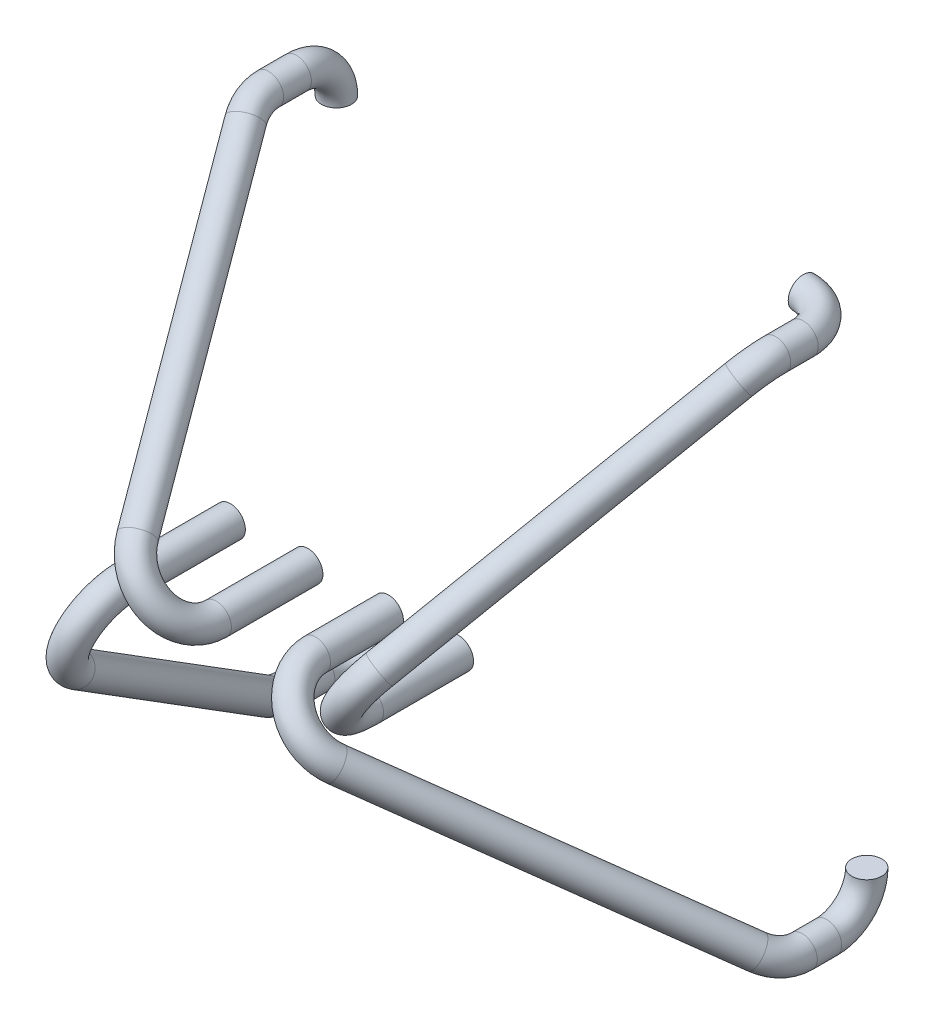
ISO-10303-21;
HEADER;
FILE_DESCRIPTION(('STEP AP214'),'2;1');
FILE_NAME('part.step','',(''),(''),'','','');
FILE_SCHEMA(('AUTOMOTIVE_DESIGN { 1 0 10303 214 1 1 1 1 }'));
ENDSEC;
DATA;
#1=APPLICATION_CONTEXT('core data for automotive mechanical design processes');
#2=APPLICATION_PROTOCOL_DEFINITION('international standard','automotive_design',2000,#1);
#3=PRODUCT_CONTEXT('',#1,'mechanical');
#4=PRODUCT('Part','Part','',(#3));
#5=PRODUCT_RELATED_PRODUCT_CATEGORY('part','',(#4));
#6=PRODUCT_DEFINITION_FORMATION('','',#4);
#7=PRODUCT_DEFINITION_CONTEXT('part definition',#1,'design');
#8=PRODUCT_DEFINITION('design','',#6,#7);
#9=PRODUCT_DEFINITION_SHAPE('','',#8);
#10=(LENGTH_UNIT() NAMED_UNIT(*) SI_UNIT(.MILLI.,.METRE.));
#11=(NAMED_UNIT(*) PLANE_ANGLE_UNIT() SI_UNIT($,.RADIAN.));
#12=(NAMED_UNIT(*) SI_UNIT($,.STERADIAN.) SOLID_ANGLE_UNIT());
#13=UNCERTAINTY_MEASURE_WITH_UNIT(LENGTH_MEASURE(1.E-05),#10,'distance_accuracy_value','');
#14=(GEOMETRIC_REPRESENTATION_CONTEXT(3) GLOBAL_UNCERTAINTY_ASSIGNED_CONTEXT((#13)) GLOBAL_UNIT_ASSIGNED_CONTEXT((#10,
#11,#12)) REPRESENTATION_CONTEXT('',''));
#15=CARTESIAN_POINT('',(0.,0.,0.));
#16=DIRECTION('',(0.,0.,1.));
#17=DIRECTION('',(1.,0.,0.));
#18=AXIS2_PLACEMENT_3D('',#15,#16,#17);
#19=CARTESIAN_POINT('',(15.3,0.,129.9));
#20=DIRECTION('',(0.,0.,-1.));
#21=DIRECTION('',(0.,-1.,0.));
#22=AXIS2_PLACEMENT_3D('',#19,#20,#21);
#23=PLANE('',#22);
#24=CARTESIAN_POINT('',(15.3,0.,129.9));
#25=DIRECTION('',(0.,0.,-1.));
#26=DIRECTION('',(-0.441251924063759,0.897383273473509,0.));
#27=AXIS2_PLACEMENT_3D('',#24,#25,#26);
#28=CIRCLE('',#27,3.);
#29=CARTESIAN_POINT('',(13.9762442278087,2.69214982042053,129.9));
#30=VERTEX_POINT('',#29);
#31=EDGE_CURVE('P0_E10',#30,#30,#28,.T.);
#32=ORIENTED_EDGE('',*,*,#31,.T.);
#33=EDGE_LOOP('',(#32));
#34=FACE_BOUND('',#33,.T.);
#35=ADVANCED_FACE('P0_F15',(#34),#23,.T.);
#36=CARTESIAN_POINT('',(40.3,53.,86.));
#37=DIRECTION('',(1.,0.,0.));
#38=DIRECTION('',(0.,1.,0.));
#39=AXIS2_PLACEMENT_3D('',#36,#37,#38);
#40=PLANE('',#39);
#41=CARTESIAN_POINT('',(40.3,53.,86.));
#42=DIRECTION('',(1.,0.,0.));
#43=DIRECTION('',(0.,0.,1.));
#44=AXIS2_PLACEMENT_3D('',#41,#42,#43);
#45=CIRCLE('',#44,3.);
#46=CARTESIAN_POINT('',(40.3,53.,89.));
#47=VERTEX_POINT('',#46);
#48=EDGE_CURVE('P0_E46',#47,#47,#45,.T.);
#49=ORIENTED_EDGE('',*,*,#48,.F.);
#50=EDGE_LOOP('',(#49));
#51=FACE_BOUND('',#50,.T.);
#52=ADVANCED_FACE('P0_F79',(#51),#40,.F.);
#53=CARTESIAN_POINT('',(15.3,0.,147.87522996171));
#54=DIRECTION('',(0.,0.,-1.));
#55=DIRECTION('',(-0.441251924063759,0.897383273473509,0.));
#56=AXIS2_PLACEMENT_3D('',#53,#54,#55);
#57=CYLINDRICAL_SURFACE('',#56,3.);
#58=ORIENTED_EDGE('',*,*,#31,.F.);
#59=EDGE_LOOP('',(#58));
#60=FACE_BOUND('',#59,.T.);
#61=CARTESIAN_POINT('',(15.3,0.,147.87522996171));
#62=DIRECTION('',(0.,0.,1.));
#63=DIRECTION('',(-0.528558452745041,-0.848896908954066,0.));
#64=AXIS2_PLACEMENT_3D('',#61,#62,#63);
#65=CIRCLE('',#64,3.);
#66=CARTESIAN_POINT('',(13.7143246417651,-2.54669072686217,147.87522996171));
#67=VERTEX_POINT('',#66);
#68=EDGE_CURVE('P0_E23',#67,#67,#65,.T.);
#69=ORIENTED_EDGE('',*,*,#68,.F.);
#70=EDGE_LOOP('',(#69));
#71=FACE_BOUND('',#70,.T.);
#72=ADVANCED_FACE('P0_F17',(#60,#71),#57,.T.);
#73=CARTESIAN_POINT('',(20.057026074705,7.640072180587,147.87522996171));
#74=DIRECTION('',(0.848896908954174,-0.528558452744869,1.8632009515487E-13));
#75=DIRECTION('',(0.389289371715224,0.625222324270361,0.67642503672139));
#76=AXIS2_PLACEMENT_3D('',#73,#74,#75);
#77=TOROIDAL_SURFACE('',#76,9.,3.);
#78=CARTESIAN_POINT('',(23.560630420144,13.267073099019,153.9630552922));
#79=DIRECTION('',(-0.357530170807117,-0.574215122812097,0.736511486466112));
#80=DIRECTION('',(-0.926388150015953,0.118225092398994,-0.357530170806982));
#81=AXIS2_PLACEMENT_3D('',#78,#79,#80);
#82=CIRCLE('',#81,3.);
#83=CARTESIAN_POINT('',(24.7284985352912,15.1427400718311,155.992330402365));
#84=VERTEX_POINT('',#83);
#85=EDGE_CURVE('P0_E32',#84,#84,#82,.T.);
#86=CARTESIAN_POINT('',(20.057026074705,7.640072180587,147.87522996171));
#87=DIRECTION('',(0.848896908954174,-0.528558452744869,1.8632009515487E-13));
#88=DIRECTION('',(0.389289371715224,0.625222324270361,0.67642503672139));
#89=AXIS2_PLACEMENT_3D('',#86,#87,#88);
#90=CIRCLE('',#89,12.);
#91=EDGE_CURVE('',#84,#67,#90,.T.);
#92=ORIENTED_EDGE('',*,*,#85,.T.);
#93=ORIENTED_EDGE('',*,*,#68,.T.);
#94=ORIENTED_EDGE('',*,*,#91,.T.);
#95=ORIENTED_EDGE('',*,*,#91,.F.);
#96=EDGE_LOOP('',(#92,#94,#93,#95));
#97=FACE_BOUND('',#96,.T.);
#98=ADVANCED_FACE('P0_F66',(#97),#77,.T.);
#99=CARTESIAN_POINT('',(47.046578270734,50.986928737845,105.58204642955));
#100=DIRECTION('',(-0.357530170807117,-0.574215122812097,0.736511486466112));
#101=DIRECTION('',(-0.926388150015953,0.118225092398994,-0.357530170806982));
#102=AXIS2_PLACEMENT_3D('',#99,#100,#101);
#103=CYLINDRICAL_SURFACE('',#102,3.);
#104=ORIENTED_EDGE('',*,*,#85,.F.);
#105=EDGE_LOOP('',(#104));
#106=FACE_BOUND('',#105,.T.);
#107=CARTESIAN_POINT('',(47.046578270734,50.986928737845,105.58204642955));
#108=DIRECTION('',(0.357530170807098,0.574215122812158,-0.736511486466074));
#109=DIRECTION('',(0.389289371715224,0.625222324270361,0.67642503672139));
#110=AXIS2_PLACEMENT_3D('',#107,#108,#109);
#111=CIRCLE('',#110,3.);
#112=CARTESIAN_POINT('',(48.2144463858812,52.8625957106571,107.611321539715));
#113=VERTEX_POINT('',#112);
#114=EDGE_CURVE('P0_E40',#113,#113,#111,.T.);
#115=ORIENTED_EDGE('',*,*,#114,.F.);
#116=EDGE_LOOP('',(#115));
#117=FACE_BOUND('',#116,.T.);
#118=ADVANCED_FACE('P0_F64',(#106,#117),#103,.T.);
#119=CARTESIAN_POINT('',(43.542973925295,45.359927819413,99.49422109906));
#120=DIRECTION('',(0.848896908954066,-0.528558452745041,0.));
#121=DIRECTION('',(0.528558452745041,0.848896908954066,0.));
#122=AXIS2_PLACEMENT_3D('',#119,#120,#121);
#123=TOROIDAL_SURFACE('',#122,9.,3.);
#124=CARTESIAN_POINT('',(48.3,53.,99.49422109906));
#125=DIRECTION('',(0.,0.,1.));
#126=DIRECTION('',(-1.,0.,0.));
#127=AXIS2_PLACEMENT_3D('',#124,#125,#126);
#128=CIRCLE('',#127,3.);
#129=CARTESIAN_POINT('',(49.8856753582349,55.5466907268622,99.49422109906));
#130=VERTEX_POINT('',#129);
#131=EDGE_CURVE('P0_E51',#130,#130,#128,.T.);
#132=CARTESIAN_POINT('',(43.542973925295,45.359927819413,99.49422109906));
#133=DIRECTION('',(0.848896908954066,-0.528558452745041,0.));
#134=DIRECTION('',(0.528558452745041,0.848896908954066,0.));
#135=AXIS2_PLACEMENT_3D('',#132,#133,#134);
#136=CIRCLE('',#135,12.);
#137=EDGE_CURVE('',#130,#113,#136,.T.);
#138=ORIENTED_EDGE('',*,*,#131,.T.);
#139=ORIENTED_EDGE('',*,*,#114,.T.);
#140=ORIENTED_EDGE('',*,*,#137,.T.);
#141=ORIENTED_EDGE('',*,*,#137,.F.);
#142=EDGE_LOOP('',(#138,#140,#139,#141));
#143=FACE_BOUND('',#142,.T.);
#144=ADVANCED_FACE('P0_F61',(#143),#123,.T.);
#145=CARTESIAN_POINT('',(48.3,53.,93.999));
#146=DIRECTION('',(0.,0.,1.));
#147=DIRECTION('',(-1.,0.,0.));
#148=AXIS2_PLACEMENT_3D('',#145,#146,#147);
#149=CYLINDRICAL_SURFACE('',#148,3.);
#150=ORIENTED_EDGE('',*,*,#131,.F.);
#151=EDGE_LOOP('',(#150));
#152=FACE_BOUND('',#151,.T.);
#153=CARTESIAN_POINT('',(48.3,53.,93.999));
#154=DIRECTION('',(0.,0.,-1.));
#155=DIRECTION('',(1.,0.,0.));
#156=AXIS2_PLACEMENT_3D('',#153,#154,#155);
#157=CIRCLE('',#156,3.);
#158=CARTESIAN_POINT('',(51.3,53.,93.999));
#159=VERTEX_POINT('',#158);
#160=EDGE_CURVE('P0_E49',#159,#159,#157,.T.);
#161=ORIENTED_EDGE('',*,*,#160,.F.);
#162=EDGE_LOOP('',(#161));
#163=FACE_BOUND('',#162,.T.);
#164=ADVANCED_FACE('P0_F75',(#152,#163),#149,.T.);
#165=CARTESIAN_POINT('',(40.301,53.,93.999));
#166=DIRECTION('',(0.,-1.,0.));
#167=DIRECTION('',(0.,0.,-1.));
#168=AXIS2_PLACEMENT_3D('',#165,#166,#167);
#169=TOROIDAL_SURFACE('',#168,7.999,3.);
#170=CARTESIAN_POINT('',(40.301,53.,86.));
#171=DIRECTION('',(1.,0.,0.));
#172=DIRECTION('',(0.,0.,1.));
#173=AXIS2_PLACEMENT_3D('',#170,#171,#172);
#174=CIRCLE('',#173,3.);
#175=CARTESIAN_POINT('',(40.301,53.,83.));
#176=VERTEX_POINT('',#175);
#177=EDGE_CURVE('P0_E43',#176,#176,#174,.T.);
#178=CARTESIAN_POINT('',(40.301,53.,93.999));
#179=DIRECTION('',(0.,-1.,0.));
#180=DIRECTION('',(0.,0.,-1.));
#181=AXIS2_PLACEMENT_3D('',#178,#179,#180);
#182=CIRCLE('',#181,10.999);
#183=EDGE_CURVE('',#176,#159,#182,.T.);
#184=ORIENTED_EDGE('',*,*,#177,.T.);
#185=ORIENTED_EDGE('',*,*,#160,.T.);
#186=ORIENTED_EDGE('',*,*,#183,.T.);
#187=ORIENTED_EDGE('',*,*,#183,.F.);
#188=EDGE_LOOP('',(#184,#186,#185,#187));
#189=FACE_BOUND('',#188,.T.);
#190=ADVANCED_FACE('P0_F90',(#189),#169,.T.);
#191=CARTESIAN_POINT('',(40.3,53.,86.));
#192=DIRECTION('',(1.,0.,0.));
#193=DIRECTION('',(0.,0.,1.));
#194=AXIS2_PLACEMENT_3D('',#191,#192,#193);
#195=CYLINDRICAL_SURFACE('',#194,3.);
#196=ORIENTED_EDGE('',*,*,#177,.F.);
#197=EDGE_LOOP('',(#196));
#198=FACE_BOUND('',#197,.T.);
#199=ORIENTED_EDGE('',*,*,#48,.T.);
#200=EDGE_LOOP('',(#199));
#201=FACE_BOUND('',#200,.T.);
#202=ADVANCED_FACE('P0_F94',(#198,#201),#195,.T.);
#203=CLOSED_SHELL('',(#35,#52,#72,#98,#118,#144,#164,#190,#202));
#204=MANIFOLD_SOLID_BREP('P0_B1',#203);
#205=CARTESIAN_POINT('',(-14.8,0.,129.9));
#206=DIRECTION('',(0.,0.,-1.));
#207=DIRECTION('',(0.,-1.,0.));
#208=AXIS2_PLACEMENT_3D('',#205,#206,#207);
#209=PLANE('',#208);
#210=CARTESIAN_POINT('',(-14.8,0.,129.9));
#211=DIRECTION('',(0.,0.,-1.));
#212=DIRECTION('',(-0.973099550912096,0.230385034268022,0.));
#213=AXIS2_PLACEMENT_3D('',#210,#211,#212);
#214=CIRCLE('',#213,3.);
#215=CARTESIAN_POINT('',(-17.7192986527363,0.691155102804067,129.9));
#216=VERTEX_POINT('',#215);
#217=EDGE_CURVE('P1_E10',#216,#216,#214,.T.);
#218=ORIENTED_EDGE('',*,*,#217,.T.);
#219=EDGE_LOOP('',(#218));
#220=FACE_BOUND('',#219,.T.);
#221=ADVANCED_FACE('P1_F15',(#220),#209,.T.);
#222=CARTESIAN_POINT('',(-53.,40.3,86.));
#223=DIRECTION('',(0.,1.,0.));
#224=DIRECTION('',(1.,0.,0.));
#225=AXIS2_PLACEMENT_3D('',#222,#223,#224);
#226=PLANE('',#225);
#227=CARTESIAN_POINT('',(-53.,40.3,86.));
#228=DIRECTION('',(0.,1.,0.));
#229=DIRECTION('',(0.,0.,1.));
#230=AXIS2_PLACEMENT_3D('',#227,#228,#229);
#231=CIRCLE('',#230,3.);
#232=CARTESIAN_POINT('',(-53.,40.3,89.));
#233=VERTEX_POINT('',#232);
#234=EDGE_CURVE('P1_E36',#233,#233,#231,.T.);
#235=ORIENTED_EDGE('',*,*,#234,.F.);
#236=EDGE_LOOP('',(#235));
#237=FACE_BOUND('',#236,.T.);
#238=ADVANCED_FACE('P1_F76',(#237),#226,.F.);
#239=CARTESIAN_POINT('',(-14.8,0.,148.1952931675));
#240=DIRECTION('',(0.,0.,-1.));
#241=DIRECTION('',(-0.973099550912096,0.230385034268022,0.));
#242=AXIS2_PLACEMENT_3D('',#239,#240,#241);
#243=CYLINDRICAL_SURFACE('',#242,3.);
#244=ORIENTED_EDGE('',*,*,#217,.F.);
#245=EDGE_LOOP('',(#244));
#246=FACE_BOUND('',#245,.T.);
#247=CARTESIAN_POINT('',(-14.8,0.,148.1952931675));
#248=DIRECTION('',(0.,0.,1.));
#249=DIRECTION('',(0.620328528173251,-0.784342091905317,0.));
#250=AXIS2_PLACEMENT_3D('',#247,#248,#249);
#251=CIRCLE('',#250,3.);
#252=CARTESIAN_POINT('',(-12.9390144154792,-2.35302627571637,148.1952931675));
#253=VERTEX_POINT('',#252);
#254=EDGE_CURVE('P1_E18',#253,#253,#251,.T.);
#255=ORIENTED_EDGE('',*,*,#254,.F.);
#256=EDGE_LOOP('',(#255));
#257=FACE_BOUND('',#256,.T.);
#258=ADVANCED_FACE('P1_F71',(#246,#257),#243,.T.);
#259=CARTESIAN_POINT('',(-20.38295675356,7.059078827146,148.1952931675));
#260=DIRECTION('',(0.784342091905281,0.620328528173297,0.));
#261=DIRECTION('',(-0.461999486460211,0.584151183142266,0.667325909690304));
#262=AXIS2_PLACEMENT_3D('',#259,#260,#261);
#263=TOROIDAL_SURFACE('',#262,9.,3.);
#264=CARTESIAN_POINT('',(-24.5409521317,12.316439475427,154.20122635471));
#265=DIRECTION('',(0.413961299369841,-0.523411799988945,0.744765822427671));
#266=DIRECTION('',(-0.124184131786939,-0.842981843840584,-0.523411799988741));
#267=AXIS2_PLACEMENT_3D('',#264,#265,#266);
#268=CIRCLE('',#267,3.);
#269=CARTESIAN_POINT('',(-25.9269505910815,14.0688930248558,156.203204083782));
#270=VERTEX_POINT('',#269);
#271=EDGE_CURVE('P1_E32',#270,#270,#268,.T.);
#272=CARTESIAN_POINT('',(-20.38295675356,7.059078827146,148.1952931675));
#273=DIRECTION('',(0.784342091905281,0.620328528173297,0.));
#274=DIRECTION('',(-0.461999486460211,0.584151183142266,0.667325909690304));
#275=AXIS2_PLACEMENT_3D('',#272,#273,#274);
#276=CIRCLE('',#275,12.);
#277=EDGE_CURVE('',#270,#253,#276,.T.);
#278=ORIENTED_EDGE('',*,*,#271,.T.);
#279=ORIENTED_EDGE('',*,*,#254,.T.);
#280=ORIENTED_EDGE('',*,*,#277,.T.);
#281=ORIENTED_EDGE('',*,*,#277,.F.);
#282=EDGE_LOOP('',(#278,#280,#279,#281));
#283=FACE_BOUND('',#282,.T.);
#284=ADVANCED_FACE('P1_F60',(#283),#263,.T.);
#285=CARTESIAN_POINT('',(-51.57503862458,46.498281821135,105.56367571631));
#286=DIRECTION('',(0.413961299369841,-0.523411799988945,0.744765822427671));
#287=DIRECTION('',(-0.124184131786939,-0.842981843840584,-0.523411799988741));
#288=AXIS2_PLACEMENT_3D('',#285,#286,#287);
#289=CYLINDRICAL_SURFACE('',#288,3.);
#290=ORIENTED_EDGE('',*,*,#271,.F.);
#291=EDGE_LOOP('',(#290));
#292=FACE_BOUND('',#291,.T.);
#293=CARTESIAN_POINT('',(-51.57503862458,46.498281821135,105.56367571631));
#294=DIRECTION('',(-0.413961299370079,0.523411799989099,-0.744765822427431));
#295=DIRECTION('',(-0.461999486460211,0.584151183142266,0.667325909690304));
#296=AXIS2_PLACEMENT_3D('',#293,#294,#295);
#297=CIRCLE('',#296,3.);
#298=CARTESIAN_POINT('',(-52.961037083964,48.2507353705632,107.565653445379));
#299=VERTEX_POINT('',#298);
#300=EDGE_CURVE('P1_E47',#299,#299,#297,.T.);
#301=ORIENTED_EDGE('',*,*,#300,.F.);
#302=EDGE_LOOP('',(#301));
#303=FACE_BOUND('',#302,.T.);
#304=ADVANCED_FACE('P1_F58',(#292,#303),#289,.T.);
#305=CARTESIAN_POINT('',(-47.41704324643,41.240921172853,99.557742529106));
#306=DIRECTION('',(0.784342091905317,0.620328528173251,0.));
#307=DIRECTION('',(-0.620328528173251,0.784342091905317,0.));
#308=AXIS2_PLACEMENT_3D('',#305,#306,#307);
#309=TOROIDAL_SURFACE('',#308,9.,3.);
#310=CARTESIAN_POINT('',(-53.,48.3,99.557742529107));
#311=DIRECTION('',(0.,0.,1.));
#312=DIRECTION('',(0.,-1.,0.));
#313=AXIS2_PLACEMENT_3D('',#310,#311,#312);
#314=CIRCLE('',#313,3.);
#315=CARTESIAN_POINT('',(-54.8609855845184,50.6530262757094,99.5577425291073));
#316=VERTEX_POINT('',#315);
#317=EDGE_CURVE('P1_E43',#316,#316,#314,.T.);
#318=CARTESIAN_POINT('',(-47.41704324643,41.240921172853,99.557742529106));
#319=DIRECTION('',(0.784342091905317,0.620328528173251,0.));
#320=DIRECTION('',(-0.620328528173251,0.784342091905317,0.));
#321=AXIS2_PLACEMENT_3D('',#318,#319,#320);
#322=CIRCLE('',#321,12.);
#323=EDGE_CURVE('',#316,#299,#322,.T.);
#324=ORIENTED_EDGE('',*,*,#317,.T.);
#325=ORIENTED_EDGE('',*,*,#300,.T.);
#326=ORIENTED_EDGE('',*,*,#323,.T.);
#327=ORIENTED_EDGE('',*,*,#323,.F.);
#328=EDGE_LOOP('',(#324,#326,#325,#327));
#329=FACE_BOUND('',#328,.T.);
#330=ADVANCED_FACE('P1_F55',(#329),#309,.T.);
#331=CARTESIAN_POINT('',(-53.,48.3,93.999));
#332=DIRECTION('',(0.,0.,1.));
#333=DIRECTION('',(0.,-1.,0.));
#334=AXIS2_PLACEMENT_3D('',#331,#332,#333);
#335=CYLINDRICAL_SURFACE('',#334,3.);
#336=ORIENTED_EDGE('',*,*,#317,.F.);
#337=EDGE_LOOP('',(#336));
#338=FACE_BOUND('',#337,.T.);
#339=CARTESIAN_POINT('',(-53.,48.3,93.999));
#340=DIRECTION('',(0.,0.,-1.));
#341=DIRECTION('',(0.,1.,0.));
#342=AXIS2_PLACEMENT_3D('',#339,#340,#341);
#343=CIRCLE('',#342,3.);
#344=CARTESIAN_POINT('',(-53.,51.3,93.999));
#345=VERTEX_POINT('',#344);
#346=EDGE_CURVE('P1_E39',#345,#345,#343,.T.);
#347=ORIENTED_EDGE('',*,*,#346,.F.);
#348=EDGE_LOOP('',(#347));
#349=FACE_BOUND('',#348,.T.);
#350=ADVANCED_FACE('P1_F69',(#338,#349),#335,.T.);
#351=CARTESIAN_POINT('',(-53.,40.301,93.999));
#352=DIRECTION('',(1.,0.,0.));
#353=DIRECTION('',(0.,0.,-1.));
#354=AXIS2_PLACEMENT_3D('',#351,#352,#353);
#355=TOROIDAL_SURFACE('',#354,7.999,3.);
#356=CARTESIAN_POINT('',(-53.,40.301,86.));
#357=DIRECTION('',(0.,1.,0.));
#358=DIRECTION('',(0.,0.,1.));
#359=AXIS2_PLACEMENT_3D('',#356,#357,#358);
#360=CIRCLE('',#359,3.);
#361=CARTESIAN_POINT('',(-53.,40.301,83.));
#362=VERTEX_POINT('',#361);
#363=EDGE_CURVE('P1_E35',#362,#362,#360,.T.);
#364=CARTESIAN_POINT('',(-53.,40.301,93.999));
#365=DIRECTION('',(1.,0.,0.));
#366=DIRECTION('',(0.,0.,-1.));
#367=AXIS2_PLACEMENT_3D('',#364,#365,#366);
#368=CIRCLE('',#367,10.999);
#369=EDGE_CURVE('',#362,#345,#368,.T.);
#370=ORIENTED_EDGE('',*,*,#363,.T.);
#371=ORIENTED_EDGE('',*,*,#346,.T.);
#372=ORIENTED_EDGE('',*,*,#369,.T.);
#373=ORIENTED_EDGE('',*,*,#369,.F.);
#374=EDGE_LOOP('',(#370,#372,#371,#373));
#375=FACE_BOUND('',#374,.T.);
#376=ADVANCED_FACE('P1_F92',(#375),#355,.T.);
#377=CARTESIAN_POINT('',(-53.,40.3,86.));
#378=DIRECTION('',(0.,1.,0.));
#379=DIRECTION('',(0.,0.,1.));
#380=AXIS2_PLACEMENT_3D('',#377,#378,#379);
#381=CYLINDRICAL_SURFACE('',#380,3.);
#382=ORIENTED_EDGE('',*,*,#363,.F.);
#383=EDGE_LOOP('',(#382));
#384=FACE_BOUND('',#383,.T.);
#385=ORIENTED_EDGE('',*,*,#234,.T.);
#386=EDGE_LOOP('',(#385));
#387=FACE_BOUND('',#386,.T.);
#388=ADVANCED_FACE('P1_F90',(#384,#387),#381,.T.);
#389=CLOSED_SHELL('',(#221,#238,#258,#284,#304,#330,#350,#376,#388));
#390=MANIFOLD_SOLID_BREP('P1_B1',#389);
#391=CARTESIAN_POINT('',(1.3,0.,129.9));
#392=DIRECTION('',(0.,0.,-1.));
#393=DIRECTION('',(0.,-1.,0.));
#394=AXIS2_PLACEMENT_3D('',#391,#392,#393);
#395=PLANE('',#394);
#396=CARTESIAN_POINT('',(1.3,0.,129.9));
#397=DIRECTION('',(0.,0.,-1.));
#398=DIRECTION('',(-0.997690669585959,-0.0679214827659172,0.));
#399=AXIS2_PLACEMENT_3D('',#396,#397,#398);
#400=CIRCLE('',#399,3.);
#401=CARTESIAN_POINT('',(-1.69307200875788,-0.203764448297752,129.9));
#402=VERTEX_POINT('',#401);
#403=EDGE_CURVE('P2_E10',#402,#402,#400,.T.);
#404=ORIENTED_EDGE('',*,*,#403,.T.);
#405=EDGE_LOOP('',(#404));
#406=FACE_BOUND('',#405,.T.);
#407=ADVANCED_FACE('P2_F15',(#406),#395,.T.);
#408=CARTESIAN_POINT('',(53.,-40.3,86.));
#409=DIRECTION('',(0.,-1.,0.));
#410=DIRECTION('',(0.,0.,-1.));
#411=AXIS2_PLACEMENT_3D('',#408,#409,#410);
#412=PLANE('',#411);
#413=CARTESIAN_POINT('',(53.,-40.3,86.));
#414=DIRECTION('',(0.,-1.,0.));
#415=DIRECTION('',(0.,0.,-1.));
#416=AXIS2_PLACEMENT_3D('',#413,#414,#415);
#417=CIRCLE('',#416,3.);
#418=CARTESIAN_POINT('',(53.,-40.3,83.));
#419=VERTEX_POINT('',#418);
#420=EDGE_CURVE('P2_E37',#419,#419,#417,.T.);
#421=ORIENTED_EDGE('',*,*,#420,.F.);
#422=EDGE_LOOP('',(#421));
#423=FACE_BOUND('',#422,.T.);
#424=ADVANCED_FACE('P2_F17',(#423),#412,.F.);
#425=CARTESIAN_POINT('',(1.3,0.,144.46153829951));
#426=DIRECTION('',(0.,0.,-1.));
#427=DIRECTION('',(-0.997690669585959,-0.0679214827659172,0.));
#428=AXIS2_PLACEMENT_3D('',#425,#426,#427);
#429=CYLINDRICAL_SURFACE('',#428,3.);
#430=ORIENTED_EDGE('',*,*,#403,.F.);
#431=EDGE_LOOP('',(#430));
#432=FACE_BOUND('',#431,.T.);
#433=CARTESIAN_POINT('',(1.3,0.,144.46153829951));
#434=DIRECTION('',(0.,0.,1.));
#435=DIRECTION('',(-0.730726174010094,0.682670680941088,0.));
#436=AXIS2_PLACEMENT_3D('',#433,#434,#435);
#437=CIRCLE('',#436,3.);
#438=CARTESIAN_POINT('',(-0.892178522029229,2.04801204282424,144.46153829951));
#439=VERTEX_POINT('',#438);
#440=EDGE_CURVE('P2_E19',#439,#439,#437,.T.);
#441=ORIENTED_EDGE('',*,*,#440,.F.);
#442=EDGE_LOOP('',(#441));
#443=FACE_BOUND('',#442,.T.);
#444=ADVANCED_FACE('P2_F92',(#432,#443),#429,.T.);
#445=CARTESIAN_POINT('',(7.876535566088,-6.144036128473,144.46153829951));
#446=DIRECTION('',(-0.682670680941211,-0.73072617400998,-1.9408343245299E-13));
#447=DIRECTION('',(0.477744575833087,-0.446326170459081,0.756672366236137));
#448=AXIS2_PLACEMENT_3D('',#445,#446,#447);
#449=TOROIDAL_SURFACE('',#448,9.,3.);
#450=CARTESIAN_POINT('',(12.176236748585,-10.1609716626,151.27158959564));
#451=DIRECTION('',(-0.552920303158725,0.516558039508112,0.653794256761559));
#452=DIRECTION('',(-0.172703119893036,-0.838654532092178,0.51655803950811));
#453=AXIS2_PLACEMENT_3D('',#450,#451,#452);
#454=CIRCLE('',#453,3.);
#455=CARTESIAN_POINT('',(13.6094704760833,-11.499950173975,153.541606694349));
#456=VERTEX_POINT('',#455);
#457=EDGE_CURVE('P2_E33',#456,#456,#454,.T.);
#458=CARTESIAN_POINT('',(7.876535566088,-6.144036128473,144.46153829951));
#459=DIRECTION('',(-0.682670680941211,-0.73072617400998,-1.9408343245299E-13));
#460=DIRECTION('',(0.477744575833087,-0.446326170459081,0.756672366236137));
#461=AXIS2_PLACEMENT_3D('',#458,#459,#460);
#462=CIRCLE('',#461,12.);
#463=EDGE_CURVE('',#456,#439,#462,.T.);
#464=ORIENTED_EDGE('',*,*,#457,.T.);
#465=ORIENTED_EDGE('',*,*,#440,.T.);
#466=ORIENTED_EDGE('',*,*,#463,.T.);
#467=ORIENTED_EDGE('',*,*,#463,.F.);
#468=EDGE_LOOP('',(#464,#466,#465,#467));
#469=FACE_BOUND('',#468,.T.);
#470=ADVANCED_FACE('P2_F56',(#469),#449,.T.);
#471=CARTESIAN_POINT('',(50.723165616409,-46.17289940565,105.69221664512));
#472=DIRECTION('',(-0.552920303158725,0.516558039508112,0.653794256761559));
#473=DIRECTION('',(-0.172703119893036,-0.838654532092178,0.51655803950811));
#474=AXIS2_PLACEMENT_3D('',#471,#472,#473);
#475=CYLINDRICAL_SURFACE('',#474,3.);
#476=ORIENTED_EDGE('',*,*,#457,.F.);
#477=EDGE_LOOP('',(#476));
#478=FACE_BOUND('',#477,.T.);
#479=CARTESIAN_POINT('',(50.723165616409,-46.17289940565,105.69221664512));
#480=DIRECTION('',(0.55292030315881,-0.516558039507822,-0.653794256761716));
#481=DIRECTION('',(0.477744575833087,-0.446326170459081,0.756672366236137));
#482=AXIS2_PLACEMENT_3D('',#479,#480,#481);
#483=CIRCLE('',#482,3.);
#484=CARTESIAN_POINT('',(52.1563993439088,-47.5118779170275,107.96223374383));
#485=VERTEX_POINT('',#484);
#486=EDGE_CURVE('P2_E41',#485,#485,#483,.T.);
#487=ORIENTED_EDGE('',*,*,#486,.F.);
#488=EDGE_LOOP('',(#487));
#489=FACE_BOUND('',#488,.T.);
#490=ADVANCED_FACE('P2_F58',(#478,#489),#475,.T.);
#491=CARTESIAN_POINT('',(46.423464433912,-42.15596387152,98.882165348995));
#492=DIRECTION('',(-0.682670680941088,-0.730726174010094,0.));
#493=DIRECTION('',(0.730726174010094,-0.682670680941088,0.));
#494=AXIS2_PLACEMENT_3D('',#491,#492,#493);
#495=TOROIDAL_SURFACE('',#494,9.,3.);
#496=CARTESIAN_POINT('',(53.,-48.3,98.882165348995));
#497=DIRECTION('',(0.,0.,1.));
#498=DIRECTION('',(0.,-1.,0.));
#499=AXIS2_PLACEMENT_3D('',#496,#497,#498);
#500=CIRCLE('',#499,3.);
#501=CARTESIAN_POINT('',(55.1921785220246,-50.3480120428222,98.882165348995));
#502=VERTEX_POINT('',#501);
#503=EDGE_CURVE('P2_E45',#502,#502,#500,.T.);
#504=CARTESIAN_POINT('',(46.423464433912,-42.15596387152,98.882165348995));
#505=DIRECTION('',(-0.682670680941088,-0.730726174010094,0.));
#506=DIRECTION('',(0.730726174010094,-0.682670680941088,0.));
#507=AXIS2_PLACEMENT_3D('',#504,#505,#506);
#508=CIRCLE('',#507,12.);
#509=EDGE_CURVE('',#502,#485,#508,.T.);
#510=ORIENTED_EDGE('',*,*,#503,.T.);
#511=ORIENTED_EDGE('',*,*,#486,.T.);
#512=ORIENTED_EDGE('',*,*,#509,.T.);
#513=ORIENTED_EDGE('',*,*,#509,.F.);
#514=EDGE_LOOP('',(#510,#512,#511,#513));
#515=FACE_BOUND('',#514,.T.);
#516=ADVANCED_FACE('P2_F61',(#515),#495,.T.);
#517=CARTESIAN_POINT('',(53.,-48.3,93.999));
#518=DIRECTION('',(0.,0.,1.));
#519=DIRECTION('',(0.,-1.,0.));
#520=AXIS2_PLACEMENT_3D('',#517,#518,#519);
#521=CYLINDRICAL_SURFACE('',#520,3.);
#522=ORIENTED_EDGE('',*,*,#503,.F.);
#523=EDGE_LOOP('',(#522));
#524=FACE_BOUND('',#523,.T.);
#525=CARTESIAN_POINT('',(53.,-48.3,93.999));
#526=DIRECTION('',(0.,0.,-1.));
#527=DIRECTION('',(0.,-1.,0.));
#528=AXIS2_PLACEMENT_3D('',#525,#526,#527);
#529=CIRCLE('',#528,3.);
#530=CARTESIAN_POINT('',(53.,-51.3,93.999));
#531=VERTEX_POINT('',#530);
#532=EDGE_CURVE('P2_E40',#531,#531,#529,.T.);
#533=ORIENTED_EDGE('',*,*,#532,.F.);
#534=EDGE_LOOP('',(#533));
#535=FACE_BOUND('',#534,.T.);
#536=ADVANCED_FACE('P2_F67',(#524,#535),#521,.T.);
#537=CARTESIAN_POINT('',(53.,-40.301,93.999));
#538=DIRECTION('',(-1.,0.,0.));
#539=DIRECTION('',(0.,0.,-1.));
#540=AXIS2_PLACEMENT_3D('',#537,#538,#539);
#541=TOROIDAL_SURFACE('',#540,7.999,3.);
#542=CARTESIAN_POINT('',(53.,-40.301,86.));
#543=DIRECTION('',(0.,-1.,0.));
#544=DIRECTION('',(0.,0.,-1.));
#545=AXIS2_PLACEMENT_3D('',#542,#543,#544);
#546=CIRCLE('',#545,3.);
#547=CARTESIAN_POINT('',(53.,-40.301,83.));
#548=VERTEX_POINT('',#547);
#549=EDGE_CURVE('P2_E36',#548,#548,#546,.T.);
#550=CARTESIAN_POINT('',(53.,-40.301,93.999));
#551=DIRECTION('',(-1.,0.,0.));
#552=DIRECTION('',(0.,0.,-1.));
#553=AXIS2_PLACEMENT_3D('',#550,#551,#552);
#554=CIRCLE('',#553,10.999);
#555=EDGE_CURVE('',#548,#531,#554,.T.);
#556=ORIENTED_EDGE('',*,*,#549,.T.);
#557=ORIENTED_EDGE('',*,*,#532,.T.);
#558=ORIENTED_EDGE('',*,*,#555,.T.);
#559=ORIENTED_EDGE('',*,*,#555,.F.);
#560=EDGE_LOOP('',(#556,#558,#557,#559));
#561=FACE_BOUND('',#560,.T.);
#562=ADVANCED_FACE('P2_F72',(#561),#541,.T.);
#563=CARTESIAN_POINT('',(53.,-40.3,86.));
#564=DIRECTION('',(0.,-1.,0.));
#565=DIRECTION('',(0.,0.,-1.));
#566=AXIS2_PLACEMENT_3D('',#563,#564,#565);
#567=CYLINDRICAL_SURFACE('',#566,3.);
#568=ORIENTED_EDGE('',*,*,#549,.F.);
#569=EDGE_LOOP('',(#568));
#570=FACE_BOUND('',#569,.T.);
#571=ORIENTED_EDGE('',*,*,#420,.T.);
#572=EDGE_LOOP('',(#571));
#573=FACE_BOUND('',#572,.T.);
#574=ADVANCED_FACE('P2_F78',(#570,#573),#567,.T.);
#575=CLOSED_SHELL('',(#407,#424,#444,#470,#490,#516,#536,#562,#574));
#576=MANIFOLD_SOLID_BREP('P2_B1',#575);
#577=CARTESIAN_POINT('',(-30.3,0.,129.9));
#578=DIRECTION('',(0.,0.,-1.));
#579=DIRECTION('',(0.,-1.,0.));
#580=AXIS2_PLACEMENT_3D('',#577,#578,#579);
#581=PLANE('',#580);
#582=CARTESIAN_POINT('',(-30.3,0.,129.9));
#583=DIRECTION('',(0.,0.,-1.));
#584=DIRECTION('',(-0.793169486115557,0.609000957548659,0.));
#585=AXIS2_PLACEMENT_3D('',#582,#583,#584);
#586=CIRCLE('',#585,3.);
#587=CARTESIAN_POINT('',(-32.6795084583467,1.82700287264598,129.9));
#588=VERTEX_POINT('',#587);
#589=EDGE_CURVE('P3_E10',#588,#588,#586,.T.);
#590=ORIENTED_EDGE('',*,*,#589,.T.);
#591=EDGE_LOOP('',(#590));
#592=FACE_BOUND('',#591,.T.);
#593=ADVANCED_FACE('P3_F15',(#592),#581,.T.);
#594=CARTESIAN_POINT('',(-40.3,-53.,86.));
#595=DIRECTION('',(-1.,0.,0.));
#596=DIRECTION('',(0.,0.,1.));
#597=AXIS2_PLACEMENT_3D('',#594,#595,#596);
#598=PLANE('',#597);
#599=CARTESIAN_POINT('',(-40.3,-53.,86.));
#600=DIRECTION('',(-1.,0.,0.));
#601=DIRECTION('',(0.,0.,-1.));
#602=AXIS2_PLACEMENT_3D('',#599,#600,#601);
#603=CIRCLE('',#602,3.);
#604=CARTESIAN_POINT('',(-40.3,-53.,83.));
#605=VERTEX_POINT('',#604);
#606=EDGE_CURVE('P3_E42',#605,#605,#603,.T.);
#607=ORIENTED_EDGE('',*,*,#606,.F.);
#608=EDGE_LOOP('',(#607));
#609=FACE_BOUND('',#608,.T.);
#610=ADVANCED_FACE('P3_F73',(#609),#598,.F.);
#611=CARTESIAN_POINT('',(-30.3,0.,150.15482614793));
#612=DIRECTION('',(0.,0.,-1.));
#613=DIRECTION('',(-0.793169486115557,0.609000957548659,0.));
#614=AXIS2_PLACEMENT_3D('',#611,#612,#613);
#615=CYLINDRICAL_SURFACE('',#614,3.);
#616=ORIENTED_EDGE('',*,*,#589,.F.);
#617=EDGE_LOOP('',(#616));
#618=FACE_BOUND('',#617,.T.);
#619=CARTESIAN_POINT('',(-30.3,0.,150.15482614793));
#620=DIRECTION('',(0.,0.,1.));
#621=DIRECTION('',(0.321582426358127,0.946881588720374,0.));
#622=AXIS2_PLACEMENT_3D('',#619,#620,#621);
#623=CIRCLE('',#622,3.);
#624=CARTESIAN_POINT('',(-29.3352527209265,2.84064476616185,150.15482614793));
#625=VERTEX_POINT('',#624);
#626=EDGE_CURVE('P3_E22',#625,#625,#623,.T.);
#627=ORIENTED_EDGE('',*,*,#626,.F.);
#628=EDGE_LOOP('',(#627));
#629=FACE_BOUND('',#628,.T.);
#630=ADVANCED_FACE('P3_F69',(#618,#629),#615,.T.);
#631=CARTESIAN_POINT('',(-33.19424183722,-8.521934298484,150.15482614793));
#632=DIRECTION('',(-0.946881588720334,0.321582426358245,0.));
#633=DIRECTION('',(-0.256427461275942,-0.755036413755827,0.603460828062862));
#634=AXIS2_PLACEMENT_3D('',#631,#632,#633);
#635=TOROIDAL_SURFACE('',#634,9.,3.);
#636=CARTESIAN_POINT('',(-35.5020889887,-15.31726202228,155.5859736005));
#637=DIRECTION('',(0.194062397300001,0.571405947606871,0.797392644180814));
#638=DIRECTION('',(-0.979047308239667,0.061694036850129,0.194062397299934));
#639=AXIS2_PLACEMENT_3D('',#636,#637,#638);
#640=CIRCLE('',#639,3.);
#641=CARTESIAN_POINT('',(-36.2713713725278,-17.5823712635486,157.396356084693));
#642=VERTEX_POINT('',#641);
#643=EDGE_CURVE('P3_E31',#642,#642,#640,.T.);
#644=CARTESIAN_POINT('',(-33.19424183722,-8.521934298484,150.15482614793));
#645=DIRECTION('',(-0.946881588720334,0.321582426358245,0.));
#646=DIRECTION('',(-0.256427461275942,-0.755036413755827,0.603460828062862));
#647=AXIS2_PLACEMENT_3D('',#644,#645,#646);
#648=CIRCLE('',#647,12.);
#649=EDGE_CURVE('',#642,#625,#648,.T.);
#650=ORIENTED_EDGE('',*,*,#643,.T.);
#651=ORIENTED_EDGE('',*,*,#626,.T.);
#652=ORIENTED_EDGE('',*,*,#649,.T.);
#653=ORIENTED_EDGE('',*,*,#649,.F.);
#654=EDGE_LOOP('',(#650,#652,#651,#653));
#655=FACE_BOUND('',#654,.T.);
#656=ADVANCED_FACE('P3_F58',(#655),#635,.T.);
#657=CARTESIAN_POINT('',(-47.71360531425,-51.27339342531,105.40946631341));
#658=DIRECTION('',(0.194062397300001,0.571405947606871,0.797392644180814));
#659=DIRECTION('',(-0.979047308239667,0.061694036850129,0.194062397299934));
#660=AXIS2_PLACEMENT_3D('',#657,#658,#659);
#661=CYLINDRICAL_SURFACE('',#660,3.);
#662=ORIENTED_EDGE('',*,*,#643,.F.);
#663=EDGE_LOOP('',(#662));
#664=FACE_BOUND('',#663,.T.);
#665=CARTESIAN_POINT('',(-47.71360531425,-51.27339342531,105.40946631341));
#666=DIRECTION('',(-0.194062397299957,-0.571405947606873,-0.797392644180823));
#667=DIRECTION('',(-0.256427461275942,-0.755036413755827,0.603460828062862));
#668=AXIS2_PLACEMENT_3D('',#665,#666,#667);
#669=CIRCLE('',#668,3.);
#670=CARTESIAN_POINT('',(-48.482887698079,-53.5385026665835,107.219848797602));
#671=VERTEX_POINT('',#670);
#672=EDGE_CURVE('P3_E39',#671,#671,#669,.T.);
#673=ORIENTED_EDGE('',*,*,#672,.F.);
#674=EDGE_LOOP('',(#673));
#675=FACE_BOUND('',#674,.T.);
#676=ADVANCED_FACE('P3_F56',(#664,#675),#661,.T.);
#677=CARTESIAN_POINT('',(-45.40575816277,-44.47806570151,99.978318860851));
#678=DIRECTION('',(-0.946881588720374,0.321582426358127,0.));
#679=DIRECTION('',(-0.321582426358127,-0.946881588720374,0.));
#680=AXIS2_PLACEMENT_3D('',#677,#678,#679);
#681=TOROIDAL_SURFACE('',#680,9.,3.);
#682=CARTESIAN_POINT('',(-48.3,-53.,99.978318860851));
#683=DIRECTION('',(0.,0.,1.));
#684=DIRECTION('',(-1.,0.,0.));
#685=AXIS2_PLACEMENT_3D('',#682,#683,#684);
#686=CIRCLE('',#685,3.);
#687=CARTESIAN_POINT('',(-49.264747279073,-55.8406447661526,99.978318860851));
#688=VERTEX_POINT('',#687);
#689=EDGE_CURVE('P3_E44',#688,#688,#686,.T.);
#690=CARTESIAN_POINT('',(-45.40575816277,-44.47806570151,99.978318860851));
#691=DIRECTION('',(-0.946881588720374,0.321582426358127,0.));
#692=DIRECTION('',(-0.321582426358127,-0.946881588720374,0.));
#693=AXIS2_PLACEMENT_3D('',#690,#691,#692);
#694=CIRCLE('',#693,12.);
#695=EDGE_CURVE('',#688,#671,#694,.T.);
#696=ORIENTED_EDGE('',*,*,#689,.T.);
#697=ORIENTED_EDGE('',*,*,#672,.T.);
#698=ORIENTED_EDGE('',*,*,#695,.T.);
#699=ORIENTED_EDGE('',*,*,#695,.F.);
#700=EDGE_LOOP('',(#696,#698,#697,#699));
#701=FACE_BOUND('',#700,.T.);
#702=ADVANCED_FACE('P3_F53',(#701),#681,.T.);
#703=CARTESIAN_POINT('',(-48.3,-53.,93.999));
#704=DIRECTION('',(0.,0.,1.));
#705=DIRECTION('',(-1.,0.,0.));
#706=AXIS2_PLACEMENT_3D('',#703,#704,#705);
#707=CYLINDRICAL_SURFACE('',#706,3.);
#708=ORIENTED_EDGE('',*,*,#689,.F.);
#709=EDGE_LOOP('',(#708));
#710=FACE_BOUND('',#709,.T.);
#711=CARTESIAN_POINT('',(-48.3,-53.,93.999));
#712=DIRECTION('',(0.,0.,-1.));
#713=DIRECTION('',(-1.,0.,0.));
#714=AXIS2_PLACEMENT_3D('',#711,#712,#713);
#715=CIRCLE('',#714,3.);
#716=CARTESIAN_POINT('',(-51.3,-53.,93.999));
#717=VERTEX_POINT('',#716);
#718=EDGE_CURVE('P3_E47',#717,#717,#715,.T.);
#719=ORIENTED_EDGE('',*,*,#718,.F.);
#720=EDGE_LOOP('',(#719));
#721=FACE_BOUND('',#720,.T.);
#722=ADVANCED_FACE('P3_F67',(#710,#721),#707,.T.);
#723=CARTESIAN_POINT('',(-40.301,-53.,93.999));
#724=DIRECTION('',(0.,1.,0.));
#725=DIRECTION('',(0.,0.,-1.));
#726=AXIS2_PLACEMENT_3D('',#723,#724,#725);
#727=TOROIDAL_SURFACE('',#726,7.999,3.);
#728=CARTESIAN_POINT('',(-40.301,-53.,86.));
#729=DIRECTION('',(-1.,0.,0.));
#730=DIRECTION('',(0.,0.,-1.));
#731=AXIS2_PLACEMENT_3D('',#728,#729,#730);
#732=CIRCLE('',#731,3.);
#733=CARTESIAN_POINT('',(-40.301,-53.,83.));
#734=VERTEX_POINT('',#733);
#735=EDGE_CURVE('P3_E106',#734,#734,#732,.T.);
#736=CARTESIAN_POINT('',(-40.301,-53.,93.999));
#737=DIRECTION('',(0.,1.,0.));
#738=DIRECTION('',(0.,0.,-1.));
#739=AXIS2_PLACEMENT_3D('',#736,#737,#738);
#740=CIRCLE('',#739,10.999);
#741=EDGE_CURVE('',#734,#717,#740,.T.);
#742=ORIENTED_EDGE('',*,*,#735,.T.);
#743=ORIENTED_EDGE('',*,*,#718,.T.);
#744=ORIENTED_EDGE('',*,*,#741,.T.);
#745=ORIENTED_EDGE('',*,*,#741,.F.);
#746=EDGE_LOOP('',(#742,#744,#743,#745));
#747=FACE_BOUND('',#746,.T.);
#748=ADVANCED_FACE('P3_F88',(#747),#727,.T.);
#749=CARTESIAN_POINT('',(-40.3,-53.,86.));
#750=DIRECTION('',(-1.,0.,0.));
#751=DIRECTION('',(0.,0.,-1.));
#752=AXIS2_PLACEMENT_3D('',#749,#750,#751);
#753=CYLINDRICAL_SURFACE('',#752,3.);
#754=ORIENTED_EDGE('',*,*,#735,.F.);
#755=EDGE_LOOP('',(#754));
#756=FACE_BOUND('',#755,.T.);
#757=ORIENTED_EDGE('',*,*,#606,.T.);
#758=EDGE_LOOP('',(#757));
#759=FACE_BOUND('',#758,.T.);
#760=ADVANCED_FACE('P3_F96',(#756,#759),#753,.T.);
#761=CLOSED_SHELL('',(#593,#610,#630,#656,#676,#702,#722,#748,#760));
#762=MANIFOLD_SOLID_BREP('P3_B1',#761);
#763=ADVANCED_BREP_SHAPE_REPRESENTATION('',(#18,#204,#390,#576,#762),#14);
#764=SHAPE_DEFINITION_REPRESENTATION(#9,#763);
ENDSEC;
END-ISO-10303-21;
